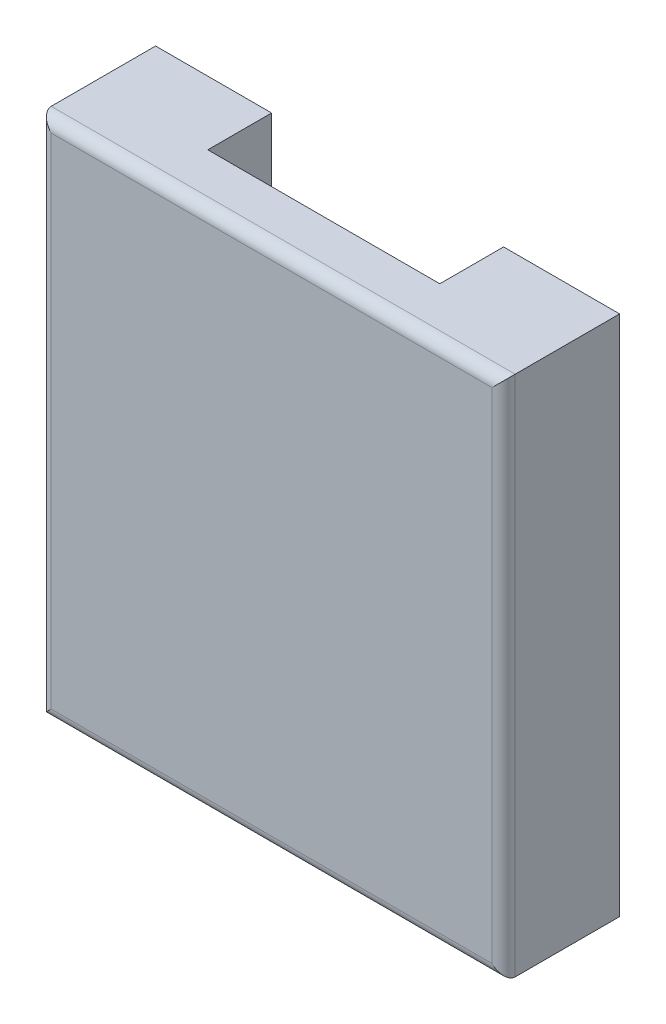
ISO-10303-21;
HEADER;
FILE_DESCRIPTION(('STEP AP214'),'2;1');
FILE_NAME('part.step','',(''),(''),'','','');
FILE_SCHEMA(('AUTOMOTIVE_DESIGN { 1 0 10303 214 1 1 1 1 }'));
ENDSEC;
DATA;
#1=APPLICATION_CONTEXT('core data for automotive mechanical design processes');
#2=APPLICATION_PROTOCOL_DEFINITION('international standard','automotive_design',2000,#1);
#3=PRODUCT_CONTEXT('',#1,'mechanical');
#4=PRODUCT('Part','Part','',(#3));
#5=PRODUCT_RELATED_PRODUCT_CATEGORY('part','',(#4));
#6=PRODUCT_DEFINITION_FORMATION('','',#4);
#7=PRODUCT_DEFINITION_CONTEXT('part definition',#1,'design');
#8=PRODUCT_DEFINITION('design','',#6,#7);
#9=PRODUCT_DEFINITION_SHAPE('','',#8);
#10=(LENGTH_UNIT() NAMED_UNIT(*) SI_UNIT(.MILLI.,.METRE.));
#11=(NAMED_UNIT(*) PLANE_ANGLE_UNIT() SI_UNIT($,.RADIAN.));
#12=(NAMED_UNIT(*) SI_UNIT($,.STERADIAN.) SOLID_ANGLE_UNIT());
#13=UNCERTAINTY_MEASURE_WITH_UNIT(LENGTH_MEASURE(1.E-05),#10,'distance_accuracy_value','');
#14=(GEOMETRIC_REPRESENTATION_CONTEXT(3) GLOBAL_UNCERTAINTY_ASSIGNED_CONTEXT((#13)) GLOBAL_UNIT_ASSIGNED_CONTEXT((#10,
#11,#12)) REPRESENTATION_CONTEXT('',''));
#15=CARTESIAN_POINT('',(0.,0.,0.));
#16=DIRECTION('',(0.,0.,1.));
#17=DIRECTION('',(1.,0.,0.));
#18=AXIS2_PLACEMENT_3D('',#15,#16,#17);
#19=CARTESIAN_POINT('',(0.,0.,0.));
#20=DIRECTION('',(0.,0.,1.));
#21=DIRECTION('',(1.,0.,0.));
#22=AXIS2_PLACEMENT_3D('',#19,#20,#21);
#23=PLANE('',#22);
#24=DIRECTION('',(0.,-1.,0.));
#25=VECTOR('',#24,1.);
#26=CARTESIAN_POINT('',(-9.99999999999999,22.5,0.));
#27=LINE('',#26,#25);
#28=CARTESIAN_POINT('',(-9.99999999999999,22.5,0.));
#29=VERTEX_POINT('',#28);
#30=CARTESIAN_POINT('',(-9.99999999999999,-22.5,0.));
#31=VERTEX_POINT('',#30);
#32=EDGE_CURVE('E138',#29,#31,#27,.T.);
#33=ORIENTED_EDGE('',*,*,#32,.F.);
#34=DIRECTION('',(-1.,0.,0.));
#35=VECTOR('',#34,1.);
#36=CARTESIAN_POINT('',(-20.,22.5,0.));
#37=LINE('',#36,#35);
#38=CARTESIAN_POINT('',(10.,22.5,0.));
#39=VERTEX_POINT('',#38);
#40=EDGE_CURVE('E143',#39,#29,#37,.T.);
#41=ORIENTED_EDGE('',*,*,#40,.F.);
#42=DIRECTION('',(0.,1.,0.));
#43=VECTOR('',#42,1.);
#44=CARTESIAN_POINT('',(10.,22.5,0.));
#45=LINE('',#44,#43);
#46=CARTESIAN_POINT('',(9.99999999999999,-22.5,0.));
#47=VERTEX_POINT('',#46);
#48=EDGE_CURVE('E145',#47,#39,#45,.T.);
#49=ORIENTED_EDGE('',*,*,#48,.F.);
#50=DIRECTION('',(1.,0.,0.));
#51=VECTOR('',#50,1.);
#52=CARTESIAN_POINT('',(-20.,-22.5,0.));
#53=LINE('',#52,#51);
#54=EDGE_CURVE('E177',#31,#47,#53,.T.);
#55=ORIENTED_EDGE('',*,*,#54,.F.);
#56=EDGE_LOOP('',(#33,#41,#49,#55));
#57=FACE_BOUND('',#56,.T.);
#58=ADVANCED_FACE('F39',(#57),#23,.F.);
#59=CARTESIAN_POINT('',(20.,22.5,4.5));
#60=DIRECTION('',(-1.,0.,0.));
#61=DIRECTION('',(0.,-1.,0.));
#62=AXIS2_PLACEMENT_3D('',#59,#60,#61);
#63=PLANE('',#62);
#64=DIRECTION('',(0.,0.,-1.));
#65=VECTOR('',#64,1.);
#66=CARTESIAN_POINT('',(20.,22.5,4.5));
#67=LINE('',#66,#65);
#68=CARTESIAN_POINT('',(20.,22.5,3.5));
#69=VERTEX_POINT('',#68);
#70=CARTESIAN_POINT('',(20.,22.5,-5.5));
#71=VERTEX_POINT('',#70);
#72=EDGE_CURVE('E189',#69,#71,#67,.T.);
#73=ORIENTED_EDGE('',*,*,#72,.F.);
#74=DIRECTION('',(0.,1.,0.));
#75=VECTOR('',#74,1.);
#76=CARTESIAN_POINT('',(20.,-22.5,3.5));
#77=LINE('',#76,#75);
#78=CARTESIAN_POINT('',(20.,-22.5,3.5));
#79=VERTEX_POINT('',#78);
#80=EDGE_CURVE('E11',#69,#79,#77,.F.);
#81=ORIENTED_EDGE('',*,*,#80,.T.);
#82=DIRECTION('',(0.,0.,-1.));
#83=VECTOR('',#82,1.);
#84=CARTESIAN_POINT('',(20.,-22.5,4.5));
#85=LINE('',#84,#83);
#86=CARTESIAN_POINT('',(20.,-22.5,-5.5));
#87=VERTEX_POINT('',#86);
#88=EDGE_CURVE('E180',#79,#87,#85,.T.);
#89=ORIENTED_EDGE('',*,*,#88,.T.);
#90=DIRECTION('',(0.,-1.,0.));
#91=VECTOR('',#90,1.);
#92=CARTESIAN_POINT('',(20.,22.5,-5.5));
#93=LINE('',#92,#91);
#94=EDGE_CURVE('E150',#71,#87,#93,.T.);
#95=ORIENTED_EDGE('',*,*,#94,.F.);
#96=EDGE_LOOP('',(#73,#81,#89,#95));
#97=FACE_BOUND('',#96,.T.);
#98=ADVANCED_FACE('F244',(#97),#63,.F.);
#99=CARTESIAN_POINT('',(-20.,22.5,4.5));
#100=DIRECTION('',(0.,-1.,0.));
#101=DIRECTION('',(0.,0.,-1.));
#102=AXIS2_PLACEMENT_3D('',#99,#100,#101);
#103=PLANE('',#102);
#104=DIRECTION('',(0.,0.,-1.));
#105=VECTOR('',#104,1.);
#106=CARTESIAN_POINT('',(-20.,22.5,4.5));
#107=LINE('',#106,#105);
#108=CARTESIAN_POINT('',(-20.,22.5,3.5));
#109=VERTEX_POINT('',#108);
#110=CARTESIAN_POINT('',(-20.,22.5,-5.5));
#111=VERTEX_POINT('',#110);
#112=EDGE_CURVE('E186',#109,#111,#107,.T.);
#113=ORIENTED_EDGE('',*,*,#112,.F.);
#114=DIRECTION('',(-1.,0.,0.));
#115=VECTOR('',#114,1.);
#116=CARTESIAN_POINT('',(20.,22.5,3.5));
#117=LINE('',#116,#115);
#118=EDGE_CURVE('E49',#109,#69,#117,.F.);
#119=ORIENTED_EDGE('',*,*,#118,.T.);
#120=ORIENTED_EDGE('',*,*,#72,.T.);
#121=DIRECTION('',(1.,0.,0.));
#122=VECTOR('',#121,1.);
#123=CARTESIAN_POINT('',(20.,22.5,-5.5));
#124=LINE('',#123,#122);
#125=CARTESIAN_POINT('',(10.,22.5,-5.5));
#126=VERTEX_POINT('',#125);
#127=EDGE_CURVE('E164',#126,#71,#124,.T.);
#128=ORIENTED_EDGE('',*,*,#127,.F.);
#129=DIRECTION('',(0.,0.,1.));
#130=VECTOR('',#129,1.);
#131=CARTESIAN_POINT('',(10.,22.5,-5.5));
#132=LINE('',#131,#130);
#133=EDGE_CURVE('E167',#126,#39,#132,.T.);
#134=ORIENTED_EDGE('',*,*,#133,.T.);
#135=ORIENTED_EDGE('',*,*,#40,.T.);
#136=DIRECTION('',(0.,0.,1.));
#137=VECTOR('',#136,1.);
#138=CARTESIAN_POINT('',(-9.99999999999999,22.5,-5.5));
#139=LINE('',#138,#137);
#140=CARTESIAN_POINT('',(-9.99999999999999,22.5,-5.5));
#141=VERTEX_POINT('',#140);
#142=EDGE_CURVE('E122',#141,#29,#139,.T.);
#143=ORIENTED_EDGE('',*,*,#142,.F.);
#144=DIRECTION('',(1.,0.,0.));
#145=VECTOR('',#144,1.);
#146=CARTESIAN_POINT('',(-20.,22.5,-5.5));
#147=LINE('',#146,#145);
#148=EDGE_CURVE('E130',#111,#141,#147,.T.);
#149=ORIENTED_EDGE('',*,*,#148,.F.);
#150=EDGE_LOOP('',(#113,#119,#120,#128,#134,#135,#143,#149));
#151=FACE_BOUND('',#150,.T.);
#152=ADVANCED_FACE('F141',(#151),#103,.F.);
#153=CARTESIAN_POINT('',(-20.,22.5,4.5));
#154=DIRECTION('',(1.,0.,0.));
#155=DIRECTION('',(0.,1.,0.));
#156=AXIS2_PLACEMENT_3D('',#153,#154,#155);
#157=PLANE('',#156);
#158=DIRECTION('',(0.,0.,-1.));
#159=VECTOR('',#158,1.);
#160=CARTESIAN_POINT('',(-20.,-22.5,4.5));
#161=LINE('',#160,#159);
#162=CARTESIAN_POINT('',(-20.,-22.5,3.5));
#163=VERTEX_POINT('',#162);
#164=CARTESIAN_POINT('',(-20.,-22.5,-5.5));
#165=VERTEX_POINT('',#164);
#166=EDGE_CURVE('E183',#163,#165,#161,.T.);
#167=ORIENTED_EDGE('',*,*,#166,.F.);
#168=DIRECTION('',(0.,-1.,0.));
#169=VECTOR('',#168,1.);
#170=CARTESIAN_POINT('',(-20.,22.5,3.5));
#171=LINE('',#170,#169);
#172=EDGE_CURVE('E64',#163,#109,#171,.F.);
#173=ORIENTED_EDGE('',*,*,#172,.T.);
#174=ORIENTED_EDGE('',*,*,#112,.T.);
#175=DIRECTION('',(0.,1.,0.));
#176=VECTOR('',#175,1.);
#177=CARTESIAN_POINT('',(-20.,22.5,-5.5));
#178=LINE('',#177,#176);
#179=EDGE_CURVE('E136',#165,#111,#178,.T.);
#180=ORIENTED_EDGE('',*,*,#179,.F.);
#181=EDGE_LOOP('',(#167,#173,#174,#180));
#182=FACE_BOUND('',#181,.T.);
#183=ADVANCED_FACE('F237',(#182),#157,.F.);
#184=CARTESIAN_POINT('',(-20.,-22.5,4.5));
#185=DIRECTION('',(0.,1.,0.));
#186=DIRECTION('',(0.,0.,1.));
#187=AXIS2_PLACEMENT_3D('',#184,#185,#186);
#188=PLANE('',#187);
#189=ORIENTED_EDGE('',*,*,#88,.F.);
#190=DIRECTION('',(1.,0.,0.));
#191=VECTOR('',#190,1.);
#192=CARTESIAN_POINT('',(-20.,-22.5,3.5));
#193=LINE('',#192,#191);
#194=EDGE_CURVE('E205',#79,#163,#193,.F.);
#195=ORIENTED_EDGE('',*,*,#194,.T.);
#196=ORIENTED_EDGE('',*,*,#166,.T.);
#197=DIRECTION('',(-1.,0.,0.));
#198=VECTOR('',#197,1.);
#199=CARTESIAN_POINT('',(-20.,-22.5,-5.5));
#200=LINE('',#199,#198);
#201=CARTESIAN_POINT('',(-10.,-22.5,-5.5));
#202=VERTEX_POINT('',#201);
#203=EDGE_CURVE('E129',#202,#165,#200,.T.);
#204=ORIENTED_EDGE('',*,*,#203,.F.);
#205=DIRECTION('',(0.,0.,1.));
#206=VECTOR('',#205,1.);
#207=CARTESIAN_POINT('',(-10.,-22.5,-5.5));
#208=LINE('',#207,#206);
#209=EDGE_CURVE('E124',#202,#31,#208,.T.);
#210=ORIENTED_EDGE('',*,*,#209,.T.);
#211=ORIENTED_EDGE('',*,*,#54,.T.);
#212=DIRECTION('',(0.,0.,1.));
#213=VECTOR('',#212,1.);
#214=CARTESIAN_POINT('',(9.99999999999999,-22.5,-5.5));
#215=LINE('',#214,#213);
#216=CARTESIAN_POINT('',(9.99999999999999,-22.5,-5.5));
#217=VERTEX_POINT('',#216);
#218=EDGE_CURVE('E171',#217,#47,#215,.T.);
#219=ORIENTED_EDGE('',*,*,#218,.F.);
#220=DIRECTION('',(-1.,0.,0.));
#221=VECTOR('',#220,1.);
#222=CARTESIAN_POINT('',(20.,-22.5,-5.5));
#223=LINE('',#222,#221);
#224=EDGE_CURVE('E158',#87,#217,#223,.T.);
#225=ORIENTED_EDGE('',*,*,#224,.F.);
#226=EDGE_LOOP('',(#189,#195,#196,#204,#210,#211,#219,#225));
#227=FACE_BOUND('',#226,.T.);
#228=ADVANCED_FACE('F248',(#227),#188,.F.);
#229=CARTESIAN_POINT('',(0.,0.,4.5));
#230=DIRECTION('',(0.,0.,1.));
#231=DIRECTION('',(1.,0.,0.));
#232=AXIS2_PLACEMENT_3D('',#229,#230,#231);
#233=PLANE('',#232);
#234=DIRECTION('',(0.,-1.,0.));
#235=VECTOR('',#234,1.);
#236=CARTESIAN_POINT('',(-19.,-22.5,4.5));
#237=LINE('',#236,#235);
#238=CARTESIAN_POINT('',(-19.,21.5,4.5));
#239=VERTEX_POINT('',#238);
#240=CARTESIAN_POINT('',(-19.,-21.5,4.5));
#241=VERTEX_POINT('',#240);
#242=EDGE_CURVE('E198',#239,#241,#237,.T.);
#243=ORIENTED_EDGE('',*,*,#242,.T.);
#244=DIRECTION('',(1.,0.,0.));
#245=VECTOR('',#244,1.);
#246=CARTESIAN_POINT('',(20.,-21.5,4.5));
#247=LINE('',#246,#245);
#248=CARTESIAN_POINT('',(19.,-21.5,4.5));
#249=VERTEX_POINT('',#248);
#250=EDGE_CURVE('E201',#241,#249,#247,.T.);
#251=ORIENTED_EDGE('',*,*,#250,.T.);
#252=DIRECTION('',(0.,1.,0.));
#253=VECTOR('',#252,1.);
#254=CARTESIAN_POINT('',(19.,22.5,4.5));
#255=LINE('',#254,#253);
#256=CARTESIAN_POINT('',(19.,21.5,4.5));
#257=VERTEX_POINT('',#256);
#258=EDGE_CURVE('E192',#249,#257,#255,.T.);
#259=ORIENTED_EDGE('',*,*,#258,.T.);
#260=DIRECTION('',(-1.,0.,0.));
#261=VECTOR('',#260,1.);
#262=CARTESIAN_POINT('',(-20.,21.5,4.5));
#263=LINE('',#262,#261);
#264=EDGE_CURVE('E195',#257,#239,#263,.T.);
#265=ORIENTED_EDGE('',*,*,#264,.T.);
#266=EDGE_LOOP('',(#243,#251,#259,#265));
#267=FACE_BOUND('',#266,.T.);
#268=ADVANCED_FACE('F270',(#267),#233,.T.);
#269=CARTESIAN_POINT('',(10.,22.5,-5.5));
#270=DIRECTION('',(1.,0.,0.));
#271=DIRECTION('',(0.,1.,0.));
#272=AXIS2_PLACEMENT_3D('',#269,#270,#271);
#273=PLANE('',#272);
#274=ORIENTED_EDGE('',*,*,#48,.T.);
#275=ORIENTED_EDGE('',*,*,#133,.F.);
#276=DIRECTION('',(0.,1.,0.));
#277=VECTOR('',#276,1.);
#278=CARTESIAN_POINT('',(10.,22.5,-5.5));
#279=LINE('',#278,#277);
#280=EDGE_CURVE('E161',#217,#126,#279,.T.);
#281=ORIENTED_EDGE('',*,*,#280,.F.);
#282=ORIENTED_EDGE('',*,*,#218,.T.);
#283=EDGE_LOOP('',(#274,#275,#281,#282));
#284=FACE_BOUND('',#283,.T.);
#285=ADVANCED_FACE('F306',(#284),#273,.F.);
#286=CARTESIAN_POINT('',(0.,0.,-5.5));
#287=DIRECTION('',(0.,0.,-1.));
#288=DIRECTION('',(-1.,0.,0.));
#289=AXIS2_PLACEMENT_3D('',#286,#287,#288);
#290=PLANE('',#289);
#291=ORIENTED_EDGE('',*,*,#94,.T.);
#292=ORIENTED_EDGE('',*,*,#224,.T.);
#293=ORIENTED_EDGE('',*,*,#280,.T.);
#294=ORIENTED_EDGE('',*,*,#127,.T.);
#295=EDGE_LOOP('',(#291,#292,#293,#294));
#296=FACE_BOUND('',#295,.T.);
#297=ADVANCED_FACE('F353',(#296),#290,.T.);
#298=CARTESIAN_POINT('',(-9.99999999999999,22.5,-5.5));
#299=DIRECTION('',(-1.,0.,0.));
#300=DIRECTION('',(0.,-1.,0.));
#301=AXIS2_PLACEMENT_3D('',#298,#299,#300);
#302=PLANE('',#301);
#303=ORIENTED_EDGE('',*,*,#32,.T.);
#304=ORIENTED_EDGE('',*,*,#209,.F.);
#305=DIRECTION('',(0.,-1.,0.));
#306=VECTOR('',#305,1.);
#307=CARTESIAN_POINT('',(-9.99999999999999,22.5,-5.5));
#308=LINE('',#307,#306);
#309=EDGE_CURVE('E117',#141,#202,#308,.T.);
#310=ORIENTED_EDGE('',*,*,#309,.F.);
#311=ORIENTED_EDGE('',*,*,#142,.T.);
#312=EDGE_LOOP('',(#303,#304,#310,#311));
#313=FACE_BOUND('',#312,.T.);
#314=ADVANCED_FACE('F120',(#313),#302,.F.);
#315=CARTESIAN_POINT('',(0.,0.,-5.5));
#316=DIRECTION('',(0.,0.,-1.));
#317=DIRECTION('',(-1.,0.,0.));
#318=AXIS2_PLACEMENT_3D('',#315,#316,#317);
#319=PLANE('',#318);
#320=ORIENTED_EDGE('',*,*,#148,.T.);
#321=ORIENTED_EDGE('',*,*,#309,.T.);
#322=ORIENTED_EDGE('',*,*,#203,.T.);
#323=ORIENTED_EDGE('',*,*,#179,.T.);
#324=EDGE_LOOP('',(#320,#321,#322,#323));
#325=FACE_BOUND('',#324,.T.);
#326=ADVANCED_FACE('F134',(#325),#319,.T.);
#327=CARTESIAN_POINT('',(0.,21.5,3.5));
#328=DIRECTION('',(1.,0.,0.));
#329=DIRECTION('',(0.,0.,-1.));
#330=AXIS2_PLACEMENT_3D('',#327,#328,#329);
#331=CYLINDRICAL_SURFACE('',#330,1.);
#332=CARTESIAN_POINT('',(19.,21.5,3.5));
#333=DIRECTION('',(0.707106781186548,-0.707106781186547,0.));
#334=DIRECTION('',(-0.707106781186547,-0.707106781186548,0.));
#335=AXIS2_PLACEMENT_3D('',#332,#333,#334);
#336=ELLIPSE('',#335,1.41421356237309,1.);
#337=EDGE_CURVE('E218',#69,#257,#336,.T.);
#338=ORIENTED_EDGE('',*,*,#337,.F.);
#339=ORIENTED_EDGE('',*,*,#118,.F.);
#340=CARTESIAN_POINT('',(-19.,21.5,3.5));
#341=DIRECTION('',(0.707106781186547,0.707106781186548,0.));
#342=DIRECTION('',(0.707106781186548,-0.707106781186547,0.));
#343=AXIS2_PLACEMENT_3D('',#340,#341,#342);
#344=ELLIPSE('',#343,1.4142135623731,1.);
#345=EDGE_CURVE('E43',#239,#109,#344,.F.);
#346=ORIENTED_EDGE('',*,*,#345,.F.);
#347=ORIENTED_EDGE('',*,*,#264,.F.);
#348=EDGE_LOOP('',(#338,#339,#346,#347));
#349=FACE_BOUND('',#348,.T.);
#350=ADVANCED_FACE('F41',(#349),#331,.T.);
#351=CARTESIAN_POINT('',(-19.,0.,3.5));
#352=DIRECTION('',(0.,1.,0.));
#353=DIRECTION('',(-1.,0.,0.));
#354=AXIS2_PLACEMENT_3D('',#351,#352,#353);
#355=CYLINDRICAL_SURFACE('',#354,1.);
#356=ORIENTED_EDGE('',*,*,#345,.T.);
#357=ORIENTED_EDGE('',*,*,#172,.F.);
#358=CARTESIAN_POINT('',(-19.,-21.5,3.5));
#359=DIRECTION('',(-0.707106781186548,0.707106781186547,0.));
#360=DIRECTION('',(0.707106781186547,0.707106781186548,0.));
#361=AXIS2_PLACEMENT_3D('',#358,#359,#360);
#362=ELLIPSE('',#361,1.41421356237309,1.);
#363=EDGE_CURVE('E216',#241,#163,#362,.F.);
#364=ORIENTED_EDGE('',*,*,#363,.F.);
#365=ORIENTED_EDGE('',*,*,#242,.F.);
#366=EDGE_LOOP('',(#356,#357,#364,#365));
#367=FACE_BOUND('',#366,.T.);
#368=ADVANCED_FACE('F254',(#367),#355,.T.);
#369=CARTESIAN_POINT('',(19.,0.,3.5));
#370=DIRECTION('',(0.,-1.,0.));
#371=DIRECTION('',(1.,0.,0.));
#372=AXIS2_PLACEMENT_3D('',#369,#370,#371);
#373=CYLINDRICAL_SURFACE('',#372,1.);
#374=ORIENTED_EDGE('',*,*,#337,.T.);
#375=ORIENTED_EDGE('',*,*,#258,.F.);
#376=CARTESIAN_POINT('',(19.,-21.5,3.5));
#377=DIRECTION('',(-0.707106781186547,-0.707106781186548,0.));
#378=DIRECTION('',(0.707106781186548,-0.707106781186547,0.));
#379=AXIS2_PLACEMENT_3D('',#376,#377,#378);
#380=ELLIPSE('',#379,1.4142135623731,1.);
#381=EDGE_CURVE('E213',#79,#249,#380,.T.);
#382=ORIENTED_EDGE('',*,*,#381,.F.);
#383=ORIENTED_EDGE('',*,*,#80,.F.);
#384=EDGE_LOOP('',(#374,#375,#382,#383));
#385=FACE_BOUND('',#384,.T.);
#386=ADVANCED_FACE('F241',(#385),#373,.T.);
#387=CARTESIAN_POINT('',(0.,-21.5,3.5));
#388=DIRECTION('',(-1.,0.,0.));
#389=DIRECTION('',(0.,0.,1.));
#390=AXIS2_PLACEMENT_3D('',#387,#388,#389);
#391=CYLINDRICAL_SURFACE('',#390,1.);
#392=ORIENTED_EDGE('',*,*,#363,.T.);
#393=ORIENTED_EDGE('',*,*,#194,.F.);
#394=ORIENTED_EDGE('',*,*,#381,.T.);
#395=ORIENTED_EDGE('',*,*,#250,.F.);
#396=EDGE_LOOP('',(#392,#393,#394,#395));
#397=FACE_BOUND('',#396,.T.);
#398=ADVANCED_FACE('F251',(#397),#391,.T.);
#399=CLOSED_SHELL('',(#58,#98,#152,#183,#228,#268,#285,#297,#314,#326,#350,#368,#386,#398));
#400=MANIFOLD_SOLID_BREP('B2',#399);
#401=ADVANCED_BREP_SHAPE_REPRESENTATION('',(#18,#400),#14);
#402=SHAPE_DEFINITION_REPRESENTATION(#9,#401);
ENDSEC;
END-ISO-10303-21;
